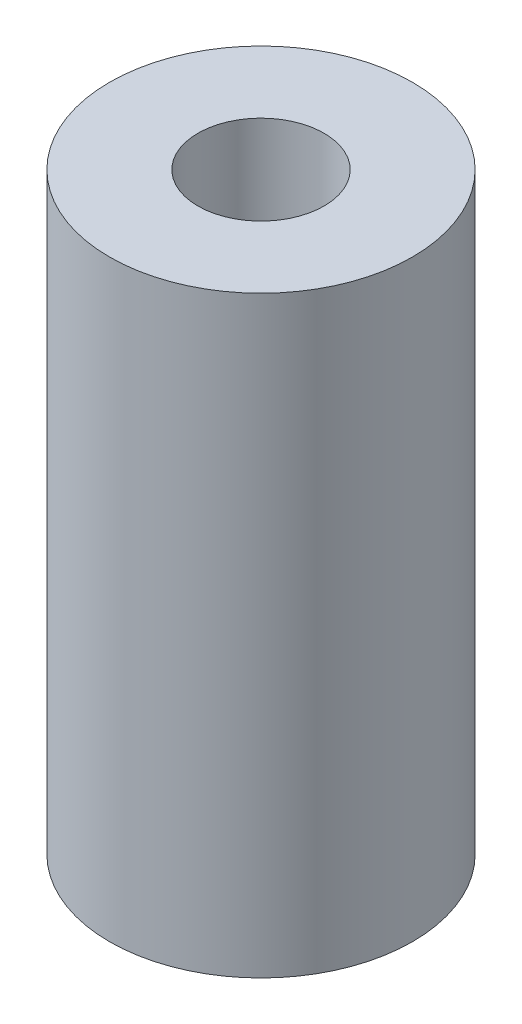
ISO-10303-21;
HEADER;
FILE_DESCRIPTION(('STEP AP214'),'2;1');
FILE_NAME('part.step','',(''),(''),'','','');
FILE_SCHEMA(('AUTOMOTIVE_DESIGN { 1 0 10303 214 1 1 1 1 }'));
ENDSEC;
DATA;
#1=APPLICATION_CONTEXT('core data for automotive mechanical design processes');
#2=APPLICATION_PROTOCOL_DEFINITION('international standard','automotive_design',2000,#1);
#3=PRODUCT_CONTEXT('',#1,'mechanical');
#4=PRODUCT('Part','Part','',(#3));
#5=PRODUCT_RELATED_PRODUCT_CATEGORY('part','',(#4));
#6=PRODUCT_DEFINITION_FORMATION('','',#4);
#7=PRODUCT_DEFINITION_CONTEXT('part definition',#1,'design');
#8=PRODUCT_DEFINITION('design','',#6,#7);
#9=PRODUCT_DEFINITION_SHAPE('','',#8);
#10=(LENGTH_UNIT() NAMED_UNIT(*) SI_UNIT(.MILLI.,.METRE.));
#11=(NAMED_UNIT(*) PLANE_ANGLE_UNIT() SI_UNIT($,.RADIAN.));
#12=(NAMED_UNIT(*) SI_UNIT($,.STERADIAN.) SOLID_ANGLE_UNIT());
#13=UNCERTAINTY_MEASURE_WITH_UNIT(LENGTH_MEASURE(1.E-05),#10,'distance_accuracy_value','');
#14=(GEOMETRIC_REPRESENTATION_CONTEXT(3) GLOBAL_UNCERTAINTY_ASSIGNED_CONTEXT((#13)) GLOBAL_UNIT_ASSIGNED_CONTEXT((#10,
#11,#12)) REPRESENTATION_CONTEXT('',''));
#15=CARTESIAN_POINT('',(0.,0.,0.));
#16=DIRECTION('',(0.,0.,1.));
#17=DIRECTION('',(1.,0.,0.));
#18=AXIS2_PLACEMENT_3D('',#15,#16,#17);
#19=CARTESIAN_POINT('',(0.,47.,0.));
#20=DIRECTION('',(0.,-1.,0.));
#21=DIRECTION('',(0.,0.,-1.));
#22=AXIS2_PLACEMENT_3D('',#19,#20,#21);
#23=CYLINDRICAL_SURFACE('',#22,12.);
#24=CARTESIAN_POINT('',(0.,47.,0.));
#25=DIRECTION('',(0.,1.,0.));
#26=DIRECTION('',(0.,0.,1.));
#27=AXIS2_PLACEMENT_3D('',#24,#25,#26);
#28=CIRCLE('',#27,12.);
#29=CARTESIAN_POINT('',(0.,47.,12.));
#30=VERTEX_POINT('',#29);
#31=EDGE_CURVE('E10',#30,#30,#28,.T.);
#32=ORIENTED_EDGE('',*,*,#31,.F.);
#33=EDGE_LOOP('',(#32));
#34=FACE_BOUND('',#33,.T.);
#35=CARTESIAN_POINT('',(0.,0.,0.));
#36=DIRECTION('',(0.,1.,0.));
#37=DIRECTION('',(0.,0.,1.));
#38=AXIS2_PLACEMENT_3D('',#35,#36,#37);
#39=CIRCLE('',#38,12.);
#40=CARTESIAN_POINT('',(0.,0.,12.));
#41=VERTEX_POINT('',#40);
#42=EDGE_CURVE('E37',#41,#41,#39,.T.);
#43=ORIENTED_EDGE('',*,*,#42,.T.);
#44=EDGE_LOOP('',(#43));
#45=FACE_BOUND('',#44,.T.);
#46=ADVANCED_FACE('F40',(#34,#45),#23,.T.);
#47=CARTESIAN_POINT('',(0.,47.,0.));
#48=DIRECTION('',(0.,1.,0.));
#49=DIRECTION('',(0.,0.,1.));
#50=AXIS2_PLACEMENT_3D('',#47,#48,#49);
#51=PLANE('',#50);
#52=CARTESIAN_POINT('',(0.,47.,0.));
#53=DIRECTION('',(0.,1.,0.));
#54=DIRECTION('',(0.,0.,1.));
#55=AXIS2_PLACEMENT_3D('',#52,#53,#54);
#56=CIRCLE('',#55,5.);
#57=CARTESIAN_POINT('',(0.,47.,5.));
#58=VERTEX_POINT('',#57);
#59=EDGE_CURVE('E47',#58,#58,#56,.T.);
#60=ORIENTED_EDGE('',*,*,#59,.F.);
#61=EDGE_LOOP('',(#60));
#62=FACE_BOUND('',#61,.T.);
#63=ORIENTED_EDGE('',*,*,#31,.T.);
#64=EDGE_LOOP('',(#63));
#65=FACE_BOUND('',#64,.T.);
#66=ADVANCED_FACE('F61',(#62,#65),#51,.T.);
#67=CARTESIAN_POINT('',(0.,0.,0.));
#68=DIRECTION('',(0.,1.,0.));
#69=DIRECTION('',(0.,0.,1.));
#70=AXIS2_PLACEMENT_3D('',#67,#68,#69);
#71=PLANE('',#70);
#72=CARTESIAN_POINT('',(0.,0.,0.));
#73=DIRECTION('',(0.,1.,0.));
#74=DIRECTION('',(0.,0.,1.));
#75=AXIS2_PLACEMENT_3D('',#72,#73,#74);
#76=CIRCLE('',#75,5.);
#77=CARTESIAN_POINT('',(0.,0.,5.));
#78=VERTEX_POINT('',#77);
#79=EDGE_CURVE('E50',#78,#78,#76,.T.);
#80=ORIENTED_EDGE('',*,*,#79,.T.);
#81=EDGE_LOOP('',(#80));
#82=FACE_BOUND('',#81,.T.);
#83=ORIENTED_EDGE('',*,*,#42,.F.);
#84=EDGE_LOOP('',(#83));
#85=FACE_BOUND('',#84,.T.);
#86=ADVANCED_FACE('F54',(#82,#85),#71,.F.);
#87=CARTESIAN_POINT('',(0.,0.,0.));
#88=DIRECTION('',(0.,1.,0.));
#89=DIRECTION('',(0.,0.,1.));
#90=AXIS2_PLACEMENT_3D('',#87,#88,#89);
#91=CYLINDRICAL_SURFACE('',#90,5.);
#92=ORIENTED_EDGE('',*,*,#79,.F.);
#93=EDGE_LOOP('',(#92));
#94=FACE_BOUND('',#93,.T.);
#95=ORIENTED_EDGE('',*,*,#59,.T.);
#96=EDGE_LOOP('',(#95));
#97=FACE_BOUND('',#96,.T.);
#98=ADVANCED_FACE('F59',(#94,#97),#91,.F.);
#99=CLOSED_SHELL('',(#46,#66,#86,#98));
#100=MANIFOLD_SOLID_BREP('B2',#99);
#101=ADVANCED_BREP_SHAPE_REPRESENTATION('',(#18,#100),#14);
#102=SHAPE_DEFINITION_REPRESENTATION(#9,#101);
ENDSEC;
END-ISO-10303-21;
